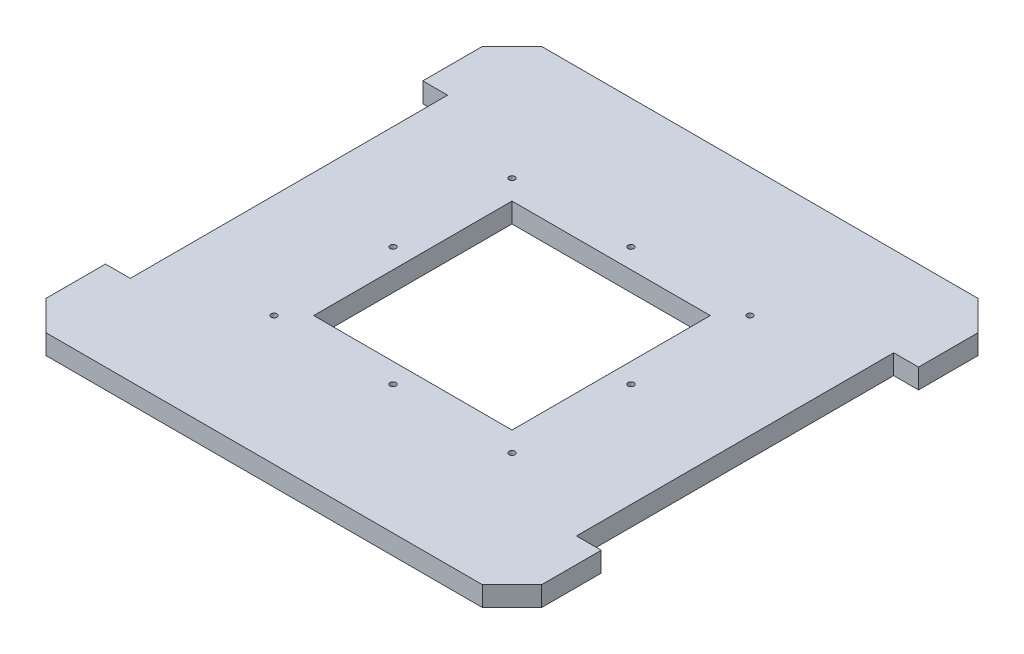
ISO-10303-21;
HEADER;
FILE_DESCRIPTION(('STEP AP214'),'2;1');
FILE_NAME('part.step','',(''),(''),'','','');
FILE_SCHEMA(('AUTOMOTIVE_DESIGN { 1 0 10303 214 1 1 1 1 }'));
ENDSEC;
DATA;
#1=APPLICATION_CONTEXT('core data for automotive mechanical design processes');
#2=APPLICATION_PROTOCOL_DEFINITION('international standard','automotive_design',2000,#1);
#3=PRODUCT_CONTEXT('',#1,'mechanical');
#4=PRODUCT('Part','Part','',(#3));
#5=PRODUCT_RELATED_PRODUCT_CATEGORY('part','',(#4));
#6=PRODUCT_DEFINITION_FORMATION('','',#4);
#7=PRODUCT_DEFINITION_CONTEXT('part definition',#1,'design');
#8=PRODUCT_DEFINITION('design','',#6,#7);
#9=PRODUCT_DEFINITION_SHAPE('','',#8);
#10=(LENGTH_UNIT() NAMED_UNIT(*) SI_UNIT(.MILLI.,.METRE.));
#11=(NAMED_UNIT(*) PLANE_ANGLE_UNIT() SI_UNIT($,.RADIAN.));
#12=(NAMED_UNIT(*) SI_UNIT($,.STERADIAN.) SOLID_ANGLE_UNIT());
#13=UNCERTAINTY_MEASURE_WITH_UNIT(LENGTH_MEASURE(1.E-05),#10,'distance_accuracy_value','');
#14=(GEOMETRIC_REPRESENTATION_CONTEXT(3) GLOBAL_UNCERTAINTY_ASSIGNED_CONTEXT((#13)) GLOBAL_UNIT_ASSIGNED_CONTEXT((#10,
#11,#12)) REPRESENTATION_CONTEXT('',''));
#15=CARTESIAN_POINT('',(0.,0.,0.));
#16=DIRECTION('',(0.,0.,1.));
#17=DIRECTION('',(1.,0.,0.));
#18=AXIS2_PLACEMENT_3D('',#15,#16,#17);
#19=CARTESIAN_POINT('',(62.5,5.,-55.0000000000001));
#20=DIRECTION('',(-1.,0.,0.));
#21=DIRECTION('',(0.,0.,1.));
#22=AXIS2_PLACEMENT_3D('',#19,#20,#21);
#23=PLANE('',#22);
#24=DIRECTION('',(0.,0.,-1.));
#25=VECTOR('',#24,1.);
#26=CARTESIAN_POINT('',(62.5,0.,-55.0000000000001));
#27=LINE('',#26,#25);
#28=CARTESIAN_POINT('',(62.5,0.,55.0000000000001));
#29=VERTEX_POINT('',#28);
#30=CARTESIAN_POINT('',(62.5,0.,40.));
#31=VERTEX_POINT('',#30);
#32=EDGE_CURVE('E338',#29,#31,#27,.T.);
#33=ORIENTED_EDGE('',*,*,#32,.T.);
#34=DIRECTION('',(0.,1.,0.));
#35=VECTOR('',#34,1.);
#36=CARTESIAN_POINT('',(62.5,0.,40.));
#37=LINE('',#36,#35);
#38=CARTESIAN_POINT('',(62.5,5.,40.));
#39=VERTEX_POINT('',#38);
#40=EDGE_CURVE('E203',#31,#39,#37,.T.);
#41=ORIENTED_EDGE('',*,*,#40,.T.);
#42=DIRECTION('',(0.,0.,-1.));
#43=VECTOR('',#42,1.);
#44=CARTESIAN_POINT('',(62.5,5.,-55.0000000000001));
#45=LINE('',#44,#43);
#46=CARTESIAN_POINT('',(62.5,5.,55.0000000000001));
#47=VERTEX_POINT('',#46);
#48=EDGE_CURVE('E322',#47,#39,#45,.T.);
#49=ORIENTED_EDGE('',*,*,#48,.F.);
#50=DIRECTION('',(0.,-1.,0.));
#51=VECTOR('',#50,1.);
#52=CARTESIAN_POINT('',(62.5,5.,55.0000000000001));
#53=LINE('',#52,#51);
#54=EDGE_CURVE('E362',#47,#29,#53,.T.);
#55=ORIENTED_EDGE('',*,*,#54,.T.);
#56=EDGE_LOOP('',(#33,#41,#49,#55));
#57=FACE_BOUND('',#56,.T.);
#58=ADVANCED_FACE('F35',(#57),#23,.F.);
#59=CARTESIAN_POINT('',(-62.5000000000001,5.,0.));
#60=DIRECTION('',(1.,0.,0.));
#61=DIRECTION('',(0.,0.,-1.));
#62=AXIS2_PLACEMENT_3D('',#59,#60,#61);
#63=PLANE('',#62);
#64=DIRECTION('',(0.,0.,1.));
#65=VECTOR('',#64,1.);
#66=CARTESIAN_POINT('',(-62.5000000000001,0.,0.));
#67=LINE('',#66,#65);
#68=CARTESIAN_POINT('',(-62.5,0.,-55.0000000000001));
#69=VERTEX_POINT('',#68);
#70=CARTESIAN_POINT('',(-62.5,0.,-40.));
#71=VERTEX_POINT('',#70);
#72=EDGE_CURVE('E348',#69,#71,#67,.T.);
#73=ORIENTED_EDGE('',*,*,#72,.T.);
#74=DIRECTION('',(0.,1.,0.));
#75=VECTOR('',#74,1.);
#76=CARTESIAN_POINT('',(-62.5,0.,-40.));
#77=LINE('',#76,#75);
#78=CARTESIAN_POINT('',(-62.5,5.,-40.));
#79=VERTEX_POINT('',#78);
#80=EDGE_CURVE('E201',#71,#79,#77,.T.);
#81=ORIENTED_EDGE('',*,*,#80,.T.);
#82=DIRECTION('',(0.,0.,1.));
#83=VECTOR('',#82,1.);
#84=CARTESIAN_POINT('',(-62.5,5.,55.0000000000001));
#85=LINE('',#84,#83);
#86=CARTESIAN_POINT('',(-62.5,5.,-55.0000000000001));
#87=VERTEX_POINT('',#86);
#88=EDGE_CURVE('E311',#87,#79,#85,.T.);
#89=ORIENTED_EDGE('',*,*,#88,.F.);
#90=DIRECTION('',(0.,-1.,0.));
#91=VECTOR('',#90,1.);
#92=CARTESIAN_POINT('',(-62.5,5.,-55.0000000000001));
#93=LINE('',#92,#91);
#94=EDGE_CURVE('E332',#87,#69,#93,.T.);
#95=ORIENTED_EDGE('',*,*,#94,.T.);
#96=EDGE_LOOP('',(#73,#81,#89,#95));
#97=FACE_BOUND('',#96,.T.);
#98=ADVANCED_FACE('F405',(#97),#63,.F.);
#99=CARTESIAN_POINT('',(0.,5.,0.));
#100=DIRECTION('',(0.,-1.,0.));
#101=DIRECTION('',(0.,0.,-1.));
#102=AXIS2_PLACEMENT_3D('',#99,#100,#101);
#103=PLANE('',#102);
#104=ORIENTED_EDGE('',*,*,#48,.T.);
#105=DIRECTION('',(1.,0.,0.));
#106=VECTOR('',#105,1.);
#107=CARTESIAN_POINT('',(62.5,5.,40.));
#108=LINE('',#107,#106);
#109=CARTESIAN_POINT('',(56.25,5.,40.));
#110=VERTEX_POINT('',#109);
#111=EDGE_CURVE('E194',#110,#39,#108,.T.);
#112=ORIENTED_EDGE('',*,*,#111,.F.);
#113=DIRECTION('',(0.,0.,1.));
#114=VECTOR('',#113,1.);
#115=CARTESIAN_POINT('',(56.25,5.,40.));
#116=LINE('',#115,#114);
#117=CARTESIAN_POINT('',(56.25,5.,-40.));
#118=VERTEX_POINT('',#117);
#119=EDGE_CURVE('E196',#118,#110,#116,.T.);
#120=ORIENTED_EDGE('',*,*,#119,.F.);
#121=DIRECTION('',(-1.,0.,0.));
#122=VECTOR('',#121,1.);
#123=CARTESIAN_POINT('',(62.5,5.,-40.));
#124=LINE('',#123,#122);
#125=CARTESIAN_POINT('',(62.5,5.,-40.));
#126=VERTEX_POINT('',#125);
#127=EDGE_CURVE('E174',#126,#118,#124,.T.);
#128=ORIENTED_EDGE('',*,*,#127,.F.);
#129=CARTESIAN_POINT('',(62.5,5.,-55.0000000000001));
#130=VERTEX_POINT('',#129);
#131=EDGE_CURVE('E321',#126,#130,#45,.T.);
#132=ORIENTED_EDGE('',*,*,#131,.T.);
#133=DIRECTION('',(-0.707106781186548,0.,-0.707106781186547));
#134=VECTOR('',#133,1.);
#135=CARTESIAN_POINT('',(55.,5.,-62.5000000000001));
#136=LINE('',#135,#134);
#137=CARTESIAN_POINT('',(55.,5.,-62.5000000000001));
#138=VERTEX_POINT('',#137);
#139=EDGE_CURVE('E325',#130,#138,#136,.T.);
#140=ORIENTED_EDGE('',*,*,#139,.T.);
#141=DIRECTION('',(-1.,0.,0.));
#142=VECTOR('',#141,1.);
#143=CARTESIAN_POINT('',(-55.,5.,-62.5000000000001));
#144=LINE('',#143,#142);
#145=CARTESIAN_POINT('',(-55.,5.,-62.5000000000001));
#146=VERTEX_POINT('',#145);
#147=EDGE_CURVE('E327',#138,#146,#144,.T.);
#148=ORIENTED_EDGE('',*,*,#147,.T.);
#149=DIRECTION('',(-0.707106781186549,0.,0.707106781186546));
#150=VECTOR('',#149,1.);
#151=CARTESIAN_POINT('',(-62.5,5.,-55.0000000000001));
#152=LINE('',#151,#150);
#153=EDGE_CURVE('E329',#146,#87,#152,.T.);
#154=ORIENTED_EDGE('',*,*,#153,.T.);
#155=ORIENTED_EDGE('',*,*,#88,.T.);
#156=DIRECTION('',(-1.,0.,0.));
#157=VECTOR('',#156,1.);
#158=CARTESIAN_POINT('',(-62.5,5.,-40.));
#159=LINE('',#158,#157);
#160=CARTESIAN_POINT('',(-56.25,5.,-40.));
#161=VERTEX_POINT('',#160);
#162=EDGE_CURVE('E211',#161,#79,#159,.T.);
#163=ORIENTED_EDGE('',*,*,#162,.F.);
#164=DIRECTION('',(0.,0.,-1.));
#165=VECTOR('',#164,1.);
#166=CARTESIAN_POINT('',(-56.25,5.,40.));
#167=LINE('',#166,#165);
#168=CARTESIAN_POINT('',(-56.25,5.,40.));
#169=VERTEX_POINT('',#168);
#170=EDGE_CURVE('E221',#169,#161,#167,.T.);
#171=ORIENTED_EDGE('',*,*,#170,.F.);
#172=DIRECTION('',(1.,0.,0.));
#173=VECTOR('',#172,1.);
#174=CARTESIAN_POINT('',(-62.5,5.,40.));
#175=LINE('',#174,#173);
#176=CARTESIAN_POINT('',(-62.5,5.,40.));
#177=VERTEX_POINT('',#176);
#178=EDGE_CURVE('E218',#177,#169,#175,.T.);
#179=ORIENTED_EDGE('',*,*,#178,.F.);
#180=CARTESIAN_POINT('',(-62.5,5.,55.0000000000001));
#181=VERTEX_POINT('',#180);
#182=EDGE_CURVE('E315',#177,#181,#85,.T.);
#183=ORIENTED_EDGE('',*,*,#182,.T.);
#184=DIRECTION('',(0.70710678118655,0.,0.707106781186545));
#185=VECTOR('',#184,1.);
#186=CARTESIAN_POINT('',(-55.,5.,62.5000000000001));
#187=LINE('',#186,#185);
#188=CARTESIAN_POINT('',(-55.,5.,62.5000000000001));
#189=VERTEX_POINT('',#188);
#190=EDGE_CURVE('E314',#181,#189,#187,.T.);
#191=ORIENTED_EDGE('',*,*,#190,.T.);
#192=DIRECTION('',(1.,0.,0.));
#193=VECTOR('',#192,1.);
#194=CARTESIAN_POINT('',(55.,5.,62.5000000000001));
#195=LINE('',#194,#193);
#196=CARTESIAN_POINT('',(55.,5.,62.5000000000001));
#197=VERTEX_POINT('',#196);
#198=EDGE_CURVE('E317',#189,#197,#195,.T.);
#199=ORIENTED_EDGE('',*,*,#198,.T.);
#200=DIRECTION('',(0.707106781186547,0.,-0.707106781186548));
#201=VECTOR('',#200,1.);
#202=CARTESIAN_POINT('',(62.5,5.,55.0000000000001));
#203=LINE('',#202,#201);
#204=EDGE_CURVE('E319',#197,#47,#203,.T.);
#205=ORIENTED_EDGE('',*,*,#204,.T.);
#206=EDGE_LOOP('',(#104,#112,#120,#128,#132,#140,#148,#154,#155,#163,#171,#179,#183,#191,#199,#205));
#207=FACE_BOUND('',#206,.T.);
#208=DIRECTION('',(0.,0.,-1.));
#209=VECTOR('',#208,1.);
#210=CARTESIAN_POINT('',(25.,5.,-25.));
#211=LINE('',#210,#209);
#212=CARTESIAN_POINT('',(25.,5.,25.));
#213=VERTEX_POINT('',#212);
#214=CARTESIAN_POINT('',(25.,5.,-25.));
#215=VERTEX_POINT('',#214);
#216=EDGE_CURVE('E280',#213,#215,#211,.T.);
#217=ORIENTED_EDGE('',*,*,#216,.F.);
#218=DIRECTION('',(1.,0.,0.));
#219=VECTOR('',#218,1.);
#220=CARTESIAN_POINT('',(-25.,5.,25.));
#221=LINE('',#220,#219);
#222=CARTESIAN_POINT('',(-25.,5.,25.));
#223=VERTEX_POINT('',#222);
#224=EDGE_CURVE('E288',#223,#213,#221,.T.);
#225=ORIENTED_EDGE('',*,*,#224,.F.);
#226=DIRECTION('',(0.,0.,1.));
#227=VECTOR('',#226,1.);
#228=CARTESIAN_POINT('',(-25.,5.,-25.));
#229=LINE('',#228,#227);
#230=CARTESIAN_POINT('',(-25.,5.,-25.));
#231=VERTEX_POINT('',#230);
#232=EDGE_CURVE('E285',#231,#223,#229,.T.);
#233=ORIENTED_EDGE('',*,*,#232,.F.);
#234=DIRECTION('',(-1.,0.,0.));
#235=VECTOR('',#234,1.);
#236=CARTESIAN_POINT('',(-25.,5.,-25.));
#237=LINE('',#236,#235);
#238=EDGE_CURVE('E282',#215,#231,#237,.T.);
#239=ORIENTED_EDGE('',*,*,#238,.F.);
#240=EDGE_LOOP('',(#217,#225,#233,#239));
#241=FACE_BOUND('',#240,.T.);
#242=CARTESIAN_POINT('',(30.,5.,-30.));
#243=DIRECTION('',(0.,1.,0.));
#244=DIRECTION('',(0.,0.,1.));
#245=AXIS2_PLACEMENT_3D('',#242,#243,#244);
#246=CIRCLE('',#245,0.750000000000002);
#247=CARTESIAN_POINT('',(30.,5.,-29.25));
#248=VERTEX_POINT('',#247);
#249=EDGE_CURVE('E274',#248,#248,#246,.T.);
#250=ORIENTED_EDGE('',*,*,#249,.F.);
#251=EDGE_LOOP('',(#250));
#252=FACE_BOUND('',#251,.T.);
#253=CARTESIAN_POINT('',(30.,5.,0.));
#254=DIRECTION('',(0.,1.,0.));
#255=DIRECTION('',(0.,0.,1.));
#256=AXIS2_PLACEMENT_3D('',#253,#254,#255);
#257=CIRCLE('',#256,0.750000000000002);
#258=CARTESIAN_POINT('',(30.,5.,0.749999999999992));
#259=VERTEX_POINT('',#258);
#260=EDGE_CURVE('E268',#259,#259,#257,.T.);
#261=ORIENTED_EDGE('',*,*,#260,.F.);
#262=EDGE_LOOP('',(#261));
#263=FACE_BOUND('',#262,.T.);
#264=CARTESIAN_POINT('',(30.,5.,30.));
#265=DIRECTION('',(0.,1.,0.));
#266=DIRECTION('',(0.,0.,1.));
#267=AXIS2_PLACEMENT_3D('',#264,#265,#266);
#268=CIRCLE('',#267,0.750000000000002);
#269=CARTESIAN_POINT('',(30.,5.,30.75));
#270=VERTEX_POINT('',#269);
#271=EDGE_CURVE('E262',#270,#270,#268,.T.);
#272=ORIENTED_EDGE('',*,*,#271,.F.);
#273=EDGE_LOOP('',(#272));
#274=FACE_BOUND('',#273,.T.);
#275=CARTESIAN_POINT('',(-30.,5.,30.));
#276=DIRECTION('',(0.,1.,0.));
#277=DIRECTION('',(0.,0.,1.));
#278=AXIS2_PLACEMENT_3D('',#275,#276,#277);
#279=CIRCLE('',#278,0.750000000000002);
#280=CARTESIAN_POINT('',(-30.,5.,30.75));
#281=VERTEX_POINT('',#280);
#282=EDGE_CURVE('E256',#281,#281,#279,.T.);
#283=ORIENTED_EDGE('',*,*,#282,.F.);
#284=EDGE_LOOP('',(#283));
#285=FACE_BOUND('',#284,.T.);
#286=CARTESIAN_POINT('',(0.,5.,30.));
#287=DIRECTION('',(0.,1.,0.));
#288=DIRECTION('',(0.,0.,1.));
#289=AXIS2_PLACEMENT_3D('',#286,#287,#288);
#290=CIRCLE('',#289,0.75);
#291=CARTESIAN_POINT('',(0.,5.,30.75));
#292=VERTEX_POINT('',#291);
#293=EDGE_CURVE('E250',#292,#292,#290,.T.);
#294=ORIENTED_EDGE('',*,*,#293,.F.);
#295=EDGE_LOOP('',(#294));
#296=FACE_BOUND('',#295,.T.);
#297=CARTESIAN_POINT('',(-30.,5.,0.));
#298=DIRECTION('',(0.,1.,0.));
#299=DIRECTION('',(0.,0.,1.));
#300=AXIS2_PLACEMENT_3D('',#297,#298,#299);
#301=CIRCLE('',#300,0.750000000000002);
#302=CARTESIAN_POINT('',(-30.,5.,0.749999999999992));
#303=VERTEX_POINT('',#302);
#304=EDGE_CURVE('E244',#303,#303,#301,.T.);
#305=ORIENTED_EDGE('',*,*,#304,.F.);
#306=EDGE_LOOP('',(#305));
#307=FACE_BOUND('',#306,.T.);
#308=CARTESIAN_POINT('',(-30.,5.,-30.));
#309=DIRECTION('',(0.,1.,0.));
#310=DIRECTION('',(0.,0.,1.));
#311=AXIS2_PLACEMENT_3D('',#308,#309,#310);
#312=CIRCLE('',#311,0.750000000000002);
#313=CARTESIAN_POINT('',(-30.,5.,-29.25));
#314=VERTEX_POINT('',#313);
#315=EDGE_CURVE('E238',#314,#314,#312,.T.);
#316=ORIENTED_EDGE('',*,*,#315,.F.);
#317=EDGE_LOOP('',(#316));
#318=FACE_BOUND('',#317,.T.);
#319=CARTESIAN_POINT('',(0.,5.,-30.));
#320=DIRECTION('',(0.,1.,0.));
#321=DIRECTION('',(0.,0.,1.));
#322=AXIS2_PLACEMENT_3D('',#319,#320,#321);
#323=CIRCLE('',#322,0.75);
#324=CARTESIAN_POINT('',(0.,5.,-29.25));
#325=VERTEX_POINT('',#324);
#326=EDGE_CURVE('E232',#325,#325,#323,.T.);
#327=ORIENTED_EDGE('',*,*,#326,.F.);
#328=EDGE_LOOP('',(#327));
#329=FACE_BOUND('',#328,.T.);
#330=ADVANCED_FACE('F388',(#207,#241,#252,#263,#274,#285,#296,#307,#318,#329),#103,.F.);
#331=CARTESIAN_POINT('',(0.,0.,0.));
#332=DIRECTION('',(0.,-1.,0.));
#333=DIRECTION('',(0.,0.,-1.));
#334=AXIS2_PLACEMENT_3D('',#331,#332,#333);
#335=PLANE('',#334);
#336=DIRECTION('',(1.,0.,0.));
#337=VECTOR('',#336,1.);
#338=CARTESIAN_POINT('',(62.5,0.,40.));
#339=LINE('',#338,#337);
#340=CARTESIAN_POINT('',(56.25,0.,40.));
#341=VERTEX_POINT('',#340);
#342=EDGE_CURVE('E187',#341,#31,#339,.T.);
#343=ORIENTED_EDGE('',*,*,#342,.T.);
#344=ORIENTED_EDGE('',*,*,#32,.F.);
#345=DIRECTION('',(0.707106781186547,0.,-0.707106781186548));
#346=VECTOR('',#345,1.);
#347=CARTESIAN_POINT('',(62.5,0.,55.0000000000001));
#348=LINE('',#347,#346);
#349=CARTESIAN_POINT('',(55.,0.,62.5000000000001));
#350=VERTEX_POINT('',#349);
#351=EDGE_CURVE('E336',#350,#29,#348,.T.);
#352=ORIENTED_EDGE('',*,*,#351,.F.);
#353=DIRECTION('',(1.,0.,0.));
#354=VECTOR('',#353,1.);
#355=CARTESIAN_POINT('',(55.,0.,62.5000000000001));
#356=LINE('',#355,#354);
#357=CARTESIAN_POINT('',(-55.,0.,62.5000000000001));
#358=VERTEX_POINT('',#357);
#359=EDGE_CURVE('E334',#358,#350,#356,.T.);
#360=ORIENTED_EDGE('',*,*,#359,.F.);
#361=DIRECTION('',(0.70710678118655,0.,0.707106781186545));
#362=VECTOR('',#361,1.);
#363=CARTESIAN_POINT('',(-55.,0.,62.5000000000001));
#364=LINE('',#363,#362);
#365=CARTESIAN_POINT('',(-62.5,0.,55.0000000000001));
#366=VERTEX_POINT('',#365);
#367=EDGE_CURVE('E310',#366,#358,#364,.T.);
#368=ORIENTED_EDGE('',*,*,#367,.F.);
#369=CARTESIAN_POINT('',(-62.5000000000002,0.,40.));
#370=VERTEX_POINT('',#369);
#371=EDGE_CURVE('E347',#370,#366,#67,.T.);
#372=ORIENTED_EDGE('',*,*,#371,.F.);
#373=DIRECTION('',(1.,0.,0.));
#374=VECTOR('',#373,1.);
#375=CARTESIAN_POINT('',(-62.5,0.,40.));
#376=LINE('',#375,#374);
#377=CARTESIAN_POINT('',(-56.25,0.,40.));
#378=VERTEX_POINT('',#377);
#379=EDGE_CURVE('E58',#370,#378,#376,.T.);
#380=ORIENTED_EDGE('',*,*,#379,.T.);
#381=DIRECTION('',(0.,0.,-1.));
#382=VECTOR('',#381,1.);
#383=CARTESIAN_POINT('',(-56.25,0.,40.));
#384=LINE('',#383,#382);
#385=CARTESIAN_POINT('',(-56.25,0.,-40.));
#386=VERTEX_POINT('',#385);
#387=EDGE_CURVE('E210',#378,#386,#384,.T.);
#388=ORIENTED_EDGE('',*,*,#387,.T.);
#389=DIRECTION('',(-1.,0.,0.));
#390=VECTOR('',#389,1.);
#391=CARTESIAN_POINT('',(-62.5,0.,-40.));
#392=LINE('',#391,#390);
#393=EDGE_CURVE('E214',#386,#71,#392,.T.);
#394=ORIENTED_EDGE('',*,*,#393,.T.);
#395=ORIENTED_EDGE('',*,*,#72,.F.);
#396=DIRECTION('',(-0.707106781186549,0.,0.707106781186546));
#397=VECTOR('',#396,1.);
#398=CARTESIAN_POINT('',(-62.5,0.,-55.0000000000001));
#399=LINE('',#398,#397);
#400=CARTESIAN_POINT('',(-55.,0.,-62.5000000000001));
#401=VERTEX_POINT('',#400);
#402=EDGE_CURVE('E345',#401,#69,#399,.T.);
#403=ORIENTED_EDGE('',*,*,#402,.F.);
#404=DIRECTION('',(-1.,0.,0.));
#405=VECTOR('',#404,1.);
#406=CARTESIAN_POINT('',(-55.,0.,-62.5000000000001));
#407=LINE('',#406,#405);
#408=CARTESIAN_POINT('',(55.,0.,-62.5000000000001));
#409=VERTEX_POINT('',#408);
#410=EDGE_CURVE('E343',#409,#401,#407,.T.);
#411=ORIENTED_EDGE('',*,*,#410,.F.);
#412=DIRECTION('',(-0.707106781186548,0.,-0.707106781186547));
#413=VECTOR('',#412,1.);
#414=CARTESIAN_POINT('',(55.,0.,-62.5000000000001));
#415=LINE('',#414,#413);
#416=CARTESIAN_POINT('',(62.5,0.,-55.0000000000001));
#417=VERTEX_POINT('',#416);
#418=EDGE_CURVE('E341',#417,#409,#415,.T.);
#419=ORIENTED_EDGE('',*,*,#418,.F.);
#420=CARTESIAN_POINT('',(62.5,0.,-40.));
#421=VERTEX_POINT('',#420);
#422=EDGE_CURVE('E193',#421,#417,#27,.T.);
#423=ORIENTED_EDGE('',*,*,#422,.F.);
#424=DIRECTION('',(-1.,0.,0.));
#425=VECTOR('',#424,1.);
#426=CARTESIAN_POINT('',(62.5,0.,-40.));
#427=LINE('',#426,#425);
#428=CARTESIAN_POINT('',(56.25,0.,-40.));
#429=VERTEX_POINT('',#428);
#430=EDGE_CURVE('E50',#421,#429,#427,.T.);
#431=ORIENTED_EDGE('',*,*,#430,.T.);
#432=DIRECTION('',(0.,0.,1.));
#433=VECTOR('',#432,1.);
#434=CARTESIAN_POINT('',(56.25,0.,40.));
#435=LINE('',#434,#433);
#436=EDGE_CURVE('E182',#429,#341,#435,.T.);
#437=ORIENTED_EDGE('',*,*,#436,.T.);
#438=EDGE_LOOP('',(#343,#344,#352,#360,#368,#372,#380,#388,#394,#395,#403,#411,#419,#423,#431,#437));
#439=FACE_BOUND('',#438,.T.);
#440=CARTESIAN_POINT('',(-30.,0.,-30.));
#441=DIRECTION('',(0.,1.,0.));
#442=DIRECTION('',(0.,0.,1.));
#443=AXIS2_PLACEMENT_3D('',#440,#441,#442);
#444=CIRCLE('',#443,0.750000000000002);
#445=CARTESIAN_POINT('',(-30.,0.,-29.25));
#446=VERTEX_POINT('',#445);
#447=EDGE_CURVE('E235',#446,#446,#444,.T.);
#448=ORIENTED_EDGE('',*,*,#447,.T.);
#449=EDGE_LOOP('',(#448));
#450=FACE_BOUND('',#449,.T.);
#451=CARTESIAN_POINT('',(0.,0.,30.));
#452=DIRECTION('',(0.,1.,0.));
#453=DIRECTION('',(0.,0.,1.));
#454=AXIS2_PLACEMENT_3D('',#451,#452,#453);
#455=CIRCLE('',#454,0.75);
#456=CARTESIAN_POINT('',(0.,0.,30.75));
#457=VERTEX_POINT('',#456);
#458=EDGE_CURVE('E247',#457,#457,#455,.T.);
#459=ORIENTED_EDGE('',*,*,#458,.T.);
#460=EDGE_LOOP('',(#459));
#461=FACE_BOUND('',#460,.T.);
#462=CARTESIAN_POINT('',(30.,0.,30.));
#463=DIRECTION('',(0.,1.,0.));
#464=DIRECTION('',(0.,0.,1.));
#465=AXIS2_PLACEMENT_3D('',#462,#463,#464);
#466=CIRCLE('',#465,0.750000000000002);
#467=CARTESIAN_POINT('',(30.,0.,30.75));
#468=VERTEX_POINT('',#467);
#469=EDGE_CURVE('E259',#468,#468,#466,.T.);
#470=ORIENTED_EDGE('',*,*,#469,.T.);
#471=EDGE_LOOP('',(#470));
#472=FACE_BOUND('',#471,.T.);
#473=CARTESIAN_POINT('',(30.,0.,-30.));
#474=DIRECTION('',(0.,1.,0.));
#475=DIRECTION('',(0.,0.,1.));
#476=AXIS2_PLACEMENT_3D('',#473,#474,#475);
#477=CIRCLE('',#476,0.750000000000002);
#478=CARTESIAN_POINT('',(30.,0.,-29.25));
#479=VERTEX_POINT('',#478);
#480=EDGE_CURVE('E271',#479,#479,#477,.T.);
#481=ORIENTED_EDGE('',*,*,#480,.T.);
#482=EDGE_LOOP('',(#481));
#483=FACE_BOUND('',#482,.T.);
#484=DIRECTION('',(1.,0.,0.));
#485=VECTOR('',#484,1.);
#486=CARTESIAN_POINT('',(-25.,0.,25.));
#487=LINE('',#486,#485);
#488=CARTESIAN_POINT('',(-25.,0.,25.));
#489=VERTEX_POINT('',#488);
#490=CARTESIAN_POINT('',(25.,0.,25.));
#491=VERTEX_POINT('',#490);
#492=EDGE_CURVE('E283',#489,#491,#487,.T.);
#493=ORIENTED_EDGE('',*,*,#492,.T.);
#494=DIRECTION('',(0.,0.,-1.));
#495=VECTOR('',#494,1.);
#496=CARTESIAN_POINT('',(25.,0.,-25.));
#497=LINE('',#496,#495);
#498=CARTESIAN_POINT('',(25.,0.,-25.));
#499=VERTEX_POINT('',#498);
#500=EDGE_CURVE('E277',#491,#499,#497,.T.);
#501=ORIENTED_EDGE('',*,*,#500,.T.);
#502=DIRECTION('',(-1.,0.,0.));
#503=VECTOR('',#502,1.);
#504=CARTESIAN_POINT('',(-25.,0.,-25.));
#505=LINE('',#504,#503);
#506=CARTESIAN_POINT('',(-25.,0.,-25.));
#507=VERTEX_POINT('',#506);
#508=EDGE_CURVE('E293',#499,#507,#505,.T.);
#509=ORIENTED_EDGE('',*,*,#508,.T.);
#510=DIRECTION('',(0.,0.,1.));
#511=VECTOR('',#510,1.);
#512=CARTESIAN_POINT('',(-25.,0.,-25.));
#513=LINE('',#512,#511);
#514=EDGE_CURVE('E296',#507,#489,#513,.T.);
#515=ORIENTED_EDGE('',*,*,#514,.T.);
#516=EDGE_LOOP('',(#493,#501,#509,#515));
#517=FACE_BOUND('',#516,.T.);
#518=CARTESIAN_POINT('',(30.,0.,0.));
#519=DIRECTION('',(0.,1.,0.));
#520=DIRECTION('',(0.,0.,1.));
#521=AXIS2_PLACEMENT_3D('',#518,#519,#520);
#522=CIRCLE('',#521,0.750000000000002);
#523=CARTESIAN_POINT('',(30.,0.,0.749999999999992));
#524=VERTEX_POINT('',#523);
#525=EDGE_CURVE('E265',#524,#524,#522,.T.);
#526=ORIENTED_EDGE('',*,*,#525,.T.);
#527=EDGE_LOOP('',(#526));
#528=FACE_BOUND('',#527,.T.);
#529=CARTESIAN_POINT('',(-30.,0.,30.));
#530=DIRECTION('',(0.,1.,0.));
#531=DIRECTION('',(0.,0.,1.));
#532=AXIS2_PLACEMENT_3D('',#529,#530,#531);
#533=CIRCLE('',#532,0.750000000000002);
#534=CARTESIAN_POINT('',(-30.,0.,30.75));
#535=VERTEX_POINT('',#534);
#536=EDGE_CURVE('E253',#535,#535,#533,.T.);
#537=ORIENTED_EDGE('',*,*,#536,.T.);
#538=EDGE_LOOP('',(#537));
#539=FACE_BOUND('',#538,.T.);
#540=CARTESIAN_POINT('',(-30.,0.,0.));
#541=DIRECTION('',(0.,1.,0.));
#542=DIRECTION('',(0.,0.,1.));
#543=AXIS2_PLACEMENT_3D('',#540,#541,#542);
#544=CIRCLE('',#543,0.750000000000002);
#545=CARTESIAN_POINT('',(-30.,0.,0.749999999999992));
#546=VERTEX_POINT('',#545);
#547=EDGE_CURVE('E241',#546,#546,#544,.T.);
#548=ORIENTED_EDGE('',*,*,#547,.T.);
#549=EDGE_LOOP('',(#548));
#550=FACE_BOUND('',#549,.T.);
#551=CARTESIAN_POINT('',(0.,0.,-30.));
#552=DIRECTION('',(0.,1.,0.));
#553=DIRECTION('',(0.,0.,1.));
#554=AXIS2_PLACEMENT_3D('',#551,#552,#553);
#555=CIRCLE('',#554,0.75);
#556=CARTESIAN_POINT('',(0.,0.,-29.25));
#557=VERTEX_POINT('',#556);
#558=EDGE_CURVE('E206',#557,#557,#555,.T.);
#559=ORIENTED_EDGE('',*,*,#558,.T.);
#560=EDGE_LOOP('',(#559));
#561=FACE_BOUND('',#560,.T.);
#562=ADVANCED_FACE('F190',(#439,#450,#461,#472,#483,#517,#528,#539,#550,#561),#335,.T.);
#563=CARTESIAN_POINT('',(-55.,5.,62.5000000000001));
#564=DIRECTION('',(0.707106781186545,0.,-0.70710678118655));
#565=DIRECTION('',(-0.70710678118655,0.,-0.707106781186545));
#566=AXIS2_PLACEMENT_3D('',#563,#564,#565);
#567=PLANE('',#566);
#568=ORIENTED_EDGE('',*,*,#367,.T.);
#569=DIRECTION('',(0.,-1.,0.));
#570=VECTOR('',#569,1.);
#571=CARTESIAN_POINT('',(-55.,5.,62.5000000000001));
#572=LINE('',#571,#570);
#573=EDGE_CURVE('E43',#189,#358,#572,.T.);
#574=ORIENTED_EDGE('',*,*,#573,.F.);
#575=ORIENTED_EDGE('',*,*,#190,.F.);
#576=DIRECTION('',(0.,-1.,0.));
#577=VECTOR('',#576,1.);
#578=CARTESIAN_POINT('',(-62.5,5.,55.0000000000001));
#579=LINE('',#578,#577);
#580=EDGE_CURVE('E11',#181,#366,#579,.T.);
#581=ORIENTED_EDGE('',*,*,#580,.T.);
#582=EDGE_LOOP('',(#568,#574,#575,#581));
#583=FACE_BOUND('',#582,.T.);
#584=ADVANCED_FACE('F37',(#583),#567,.F.);
#585=CARTESIAN_POINT('',(55.,5.,62.5000000000001));
#586=DIRECTION('',(0.,0.,-1.));
#587=DIRECTION('',(-1.,0.,0.));
#588=AXIS2_PLACEMENT_3D('',#585,#586,#587);
#589=PLANE('',#588);
#590=ORIENTED_EDGE('',*,*,#359,.T.);
#591=DIRECTION('',(0.,-1.,0.));
#592=VECTOR('',#591,1.);
#593=CARTESIAN_POINT('',(55.,5.,62.5000000000001));
#594=LINE('',#593,#592);
#595=EDGE_CURVE('E365',#197,#350,#594,.T.);
#596=ORIENTED_EDGE('',*,*,#595,.F.);
#597=ORIENTED_EDGE('',*,*,#198,.F.);
#598=ORIENTED_EDGE('',*,*,#573,.T.);
#599=EDGE_LOOP('',(#590,#596,#597,#598));
#600=FACE_BOUND('',#599,.T.);
#601=ADVANCED_FACE('F372',(#600),#589,.F.);
#602=CARTESIAN_POINT('',(62.5,5.,55.0000000000001));
#603=DIRECTION('',(-0.707106781186548,0.,-0.707106781186547));
#604=DIRECTION('',(-0.707106781186547,0.,0.707106781186548));
#605=AXIS2_PLACEMENT_3D('',#602,#603,#604);
#606=PLANE('',#605);
#607=ORIENTED_EDGE('',*,*,#351,.T.);
#608=ORIENTED_EDGE('',*,*,#54,.F.);
#609=ORIENTED_EDGE('',*,*,#204,.F.);
#610=ORIENTED_EDGE('',*,*,#595,.T.);
#611=EDGE_LOOP('',(#607,#608,#609,#610));
#612=FACE_BOUND('',#611,.T.);
#613=ADVANCED_FACE('F382',(#612),#606,.F.);
#614=ORIENTED_EDGE('',*,*,#131,.F.);
#615=DIRECTION('',(0.,1.,0.));
#616=VECTOR('',#615,1.);
#617=CARTESIAN_POINT('',(62.5,0.,-40.));
#618=LINE('',#617,#616);
#619=EDGE_CURVE('E179',#421,#126,#618,.T.);
#620=ORIENTED_EDGE('',*,*,#619,.F.);
#621=ORIENTED_EDGE('',*,*,#422,.T.);
#622=DIRECTION('',(0.,-1.,0.));
#623=VECTOR('',#622,1.);
#624=CARTESIAN_POINT('',(62.5,5.,-55.0000000000001));
#625=LINE('',#624,#623);
#626=EDGE_CURVE('E359',#130,#417,#625,.T.);
#627=ORIENTED_EDGE('',*,*,#626,.F.);
#628=EDGE_LOOP('',(#614,#620,#621,#627));
#629=FACE_BOUND('',#628,.T.);
#630=ADVANCED_FACE('F423',(#629),#23,.F.);
#631=CARTESIAN_POINT('',(55.,5.,-62.5000000000001));
#632=DIRECTION('',(-0.707106781186547,0.,0.707106781186548));
#633=DIRECTION('',(0.707106781186548,0.,0.707106781186547));
#634=AXIS2_PLACEMENT_3D('',#631,#632,#633);
#635=PLANE('',#634);
#636=ORIENTED_EDGE('',*,*,#418,.T.);
#637=DIRECTION('',(0.,-1.,0.));
#638=VECTOR('',#637,1.);
#639=CARTESIAN_POINT('',(55.,5.,-62.5000000000001));
#640=LINE('',#639,#638);
#641=EDGE_CURVE('E356',#138,#409,#640,.T.);
#642=ORIENTED_EDGE('',*,*,#641,.F.);
#643=ORIENTED_EDGE('',*,*,#139,.F.);
#644=ORIENTED_EDGE('',*,*,#626,.T.);
#645=EDGE_LOOP('',(#636,#642,#643,#644));
#646=FACE_BOUND('',#645,.T.);
#647=ADVANCED_FACE('F419',(#646),#635,.F.);
#648=CARTESIAN_POINT('',(-55.,5.,-62.5000000000001));
#649=DIRECTION('',(0.,0.,1.));
#650=DIRECTION('',(1.,0.,0.));
#651=AXIS2_PLACEMENT_3D('',#648,#649,#650);
#652=PLANE('',#651);
#653=ORIENTED_EDGE('',*,*,#410,.T.);
#654=DIRECTION('',(0.,-1.,0.));
#655=VECTOR('',#654,1.);
#656=CARTESIAN_POINT('',(-55.,5.,-62.5000000000001));
#657=LINE('',#656,#655);
#658=EDGE_CURVE('E353',#146,#401,#657,.T.);
#659=ORIENTED_EDGE('',*,*,#658,.F.);
#660=ORIENTED_EDGE('',*,*,#147,.F.);
#661=ORIENTED_EDGE('',*,*,#641,.T.);
#662=EDGE_LOOP('',(#653,#659,#660,#661));
#663=FACE_BOUND('',#662,.T.);
#664=ADVANCED_FACE('F415',(#663),#652,.F.);
#665=CARTESIAN_POINT('',(-62.5,5.,-55.0000000000001));
#666=DIRECTION('',(0.707106781186546,0.,0.707106781186549));
#667=DIRECTION('',(0.707106781186549,0.,-0.707106781186546));
#668=AXIS2_PLACEMENT_3D('',#665,#666,#667);
#669=PLANE('',#668);
#670=ORIENTED_EDGE('',*,*,#402,.T.);
#671=ORIENTED_EDGE('',*,*,#94,.F.);
#672=ORIENTED_EDGE('',*,*,#153,.F.);
#673=ORIENTED_EDGE('',*,*,#658,.T.);
#674=EDGE_LOOP('',(#670,#671,#672,#673));
#675=FACE_BOUND('',#674,.T.);
#676=ADVANCED_FACE('F411',(#675),#669,.F.);
#677=ORIENTED_EDGE('',*,*,#182,.F.);
#678=DIRECTION('',(0.,1.,0.));
#679=VECTOR('',#678,1.);
#680=CARTESIAN_POINT('',(-62.5,0.,40.));
#681=LINE('',#680,#679);
#682=EDGE_CURVE('E217',#370,#177,#681,.T.);
#683=ORIENTED_EDGE('',*,*,#682,.F.);
#684=ORIENTED_EDGE('',*,*,#371,.T.);
#685=ORIENTED_EDGE('',*,*,#580,.F.);
#686=EDGE_LOOP('',(#677,#683,#684,#685));
#687=FACE_BOUND('',#686,.T.);
#688=ADVANCED_FACE('F394',(#687),#63,.F.);
#689=CARTESIAN_POINT('',(25.,5.,-25.));
#690=DIRECTION('',(-1.,0.,0.));
#691=DIRECTION('',(0.,0.,1.));
#692=AXIS2_PLACEMENT_3D('',#689,#690,#691);
#693=PLANE('',#692);
#694=ORIENTED_EDGE('',*,*,#500,.F.);
#695=DIRECTION('',(0.,-1.,0.));
#696=VECTOR('',#695,1.);
#697=CARTESIAN_POINT('',(25.,5.,25.));
#698=LINE('',#697,#696);
#699=EDGE_CURVE('E290',#213,#491,#698,.T.);
#700=ORIENTED_EDGE('',*,*,#699,.F.);
#701=ORIENTED_EDGE('',*,*,#216,.T.);
#702=DIRECTION('',(0.,-1.,0.));
#703=VECTOR('',#702,1.);
#704=CARTESIAN_POINT('',(25.,5.,-25.));
#705=LINE('',#704,#703);
#706=EDGE_CURVE('E307',#215,#499,#705,.T.);
#707=ORIENTED_EDGE('',*,*,#706,.T.);
#708=EDGE_LOOP('',(#694,#700,#701,#707));
#709=FACE_BOUND('',#708,.T.);
#710=ADVANCED_FACE('F444',(#709),#693,.T.);
#711=CARTESIAN_POINT('',(-25.,5.,-25.));
#712=DIRECTION('',(0.,0.,1.));
#713=DIRECTION('',(1.,0.,0.));
#714=AXIS2_PLACEMENT_3D('',#711,#712,#713);
#715=PLANE('',#714);
#716=ORIENTED_EDGE('',*,*,#508,.F.);
#717=ORIENTED_EDGE('',*,*,#706,.F.);
#718=ORIENTED_EDGE('',*,*,#238,.T.);
#719=DIRECTION('',(0.,-1.,0.));
#720=VECTOR('',#719,1.);
#721=CARTESIAN_POINT('',(-25.,5.,-25.));
#722=LINE('',#721,#720);
#723=EDGE_CURVE('E305',#231,#507,#722,.T.);
#724=ORIENTED_EDGE('',*,*,#723,.T.);
#725=EDGE_LOOP('',(#716,#717,#718,#724));
#726=FACE_BOUND('',#725,.T.);
#727=ADVANCED_FACE('F449',(#726),#715,.T.);
#728=CARTESIAN_POINT('',(-25.,5.,-25.));
#729=DIRECTION('',(1.,0.,0.));
#730=DIRECTION('',(0.,0.,-1.));
#731=AXIS2_PLACEMENT_3D('',#728,#729,#730);
#732=PLANE('',#731);
#733=ORIENTED_EDGE('',*,*,#514,.F.);
#734=ORIENTED_EDGE('',*,*,#723,.F.);
#735=ORIENTED_EDGE('',*,*,#232,.T.);
#736=DIRECTION('',(0.,-1.,0.));
#737=VECTOR('',#736,1.);
#738=CARTESIAN_POINT('',(-25.,5.,25.));
#739=LINE('',#738,#737);
#740=EDGE_CURVE('E303',#223,#489,#739,.T.);
#741=ORIENTED_EDGE('',*,*,#740,.T.);
#742=EDGE_LOOP('',(#733,#734,#735,#741));
#743=FACE_BOUND('',#742,.T.);
#744=ADVANCED_FACE('F597',(#743),#732,.T.);
#745=CARTESIAN_POINT('',(-25.,5.,25.));
#746=DIRECTION('',(0.,0.,-1.));
#747=DIRECTION('',(-1.,0.,0.));
#748=AXIS2_PLACEMENT_3D('',#745,#746,#747);
#749=PLANE('',#748);
#750=ORIENTED_EDGE('',*,*,#492,.F.);
#751=ORIENTED_EDGE('',*,*,#740,.F.);
#752=ORIENTED_EDGE('',*,*,#224,.T.);
#753=ORIENTED_EDGE('',*,*,#699,.T.);
#754=EDGE_LOOP('',(#750,#751,#752,#753));
#755=FACE_BOUND('',#754,.T.);
#756=ADVANCED_FACE('F587',(#755),#749,.T.);
#757=CARTESIAN_POINT('',(30.,5.,-30.));
#758=DIRECTION('',(0.,-1.,0.));
#759=DIRECTION('',(0.,0.,-1.));
#760=AXIS2_PLACEMENT_3D('',#757,#758,#759);
#761=CYLINDRICAL_SURFACE('',#760,0.750000000000002);
#762=ORIENTED_EDGE('',*,*,#249,.T.);
#763=EDGE_LOOP('',(#762));
#764=FACE_BOUND('',#763,.T.);
#765=ORIENTED_EDGE('',*,*,#480,.F.);
#766=EDGE_LOOP('',(#765));
#767=FACE_BOUND('',#766,.T.);
#768=ADVANCED_FACE('F577',(#764,#767),#761,.F.);
#769=CARTESIAN_POINT('',(30.,5.,0.));
#770=DIRECTION('',(0.,-1.,0.));
#771=DIRECTION('',(0.,0.,-1.));
#772=AXIS2_PLACEMENT_3D('',#769,#770,#771);
#773=CYLINDRICAL_SURFACE('',#772,0.750000000000002);
#774=ORIENTED_EDGE('',*,*,#260,.T.);
#775=EDGE_LOOP('',(#774));
#776=FACE_BOUND('',#775,.T.);
#777=ORIENTED_EDGE('',*,*,#525,.F.);
#778=EDGE_LOOP('',(#777));
#779=FACE_BOUND('',#778,.T.);
#780=ADVANCED_FACE('F567',(#776,#779),#773,.F.);
#781=CARTESIAN_POINT('',(30.,5.,30.));
#782=DIRECTION('',(0.,-1.,0.));
#783=DIRECTION('',(0.,0.,-1.));
#784=AXIS2_PLACEMENT_3D('',#781,#782,#783);
#785=CYLINDRICAL_SURFACE('',#784,0.750000000000002);
#786=ORIENTED_EDGE('',*,*,#271,.T.);
#787=EDGE_LOOP('',(#786));
#788=FACE_BOUND('',#787,.T.);
#789=ORIENTED_EDGE('',*,*,#469,.F.);
#790=EDGE_LOOP('',(#789));
#791=FACE_BOUND('',#790,.T.);
#792=ADVANCED_FACE('F557',(#788,#791),#785,.F.);
#793=CARTESIAN_POINT('',(-30.,5.,30.));
#794=DIRECTION('',(0.,-1.,0.));
#795=DIRECTION('',(0.,0.,-1.));
#796=AXIS2_PLACEMENT_3D('',#793,#794,#795);
#797=CYLINDRICAL_SURFACE('',#796,0.750000000000002);
#798=ORIENTED_EDGE('',*,*,#282,.T.);
#799=EDGE_LOOP('',(#798));
#800=FACE_BOUND('',#799,.T.);
#801=ORIENTED_EDGE('',*,*,#536,.F.);
#802=EDGE_LOOP('',(#801));
#803=FACE_BOUND('',#802,.T.);
#804=ADVANCED_FACE('F547',(#800,#803),#797,.F.);
#805=CARTESIAN_POINT('',(0.,5.,30.));
#806=DIRECTION('',(0.,-1.,0.));
#807=DIRECTION('',(0.,0.,-1.));
#808=AXIS2_PLACEMENT_3D('',#805,#806,#807);
#809=CYLINDRICAL_SURFACE('',#808,0.75);
#810=ORIENTED_EDGE('',*,*,#293,.T.);
#811=EDGE_LOOP('',(#810));
#812=FACE_BOUND('',#811,.T.);
#813=ORIENTED_EDGE('',*,*,#458,.F.);
#814=EDGE_LOOP('',(#813));
#815=FACE_BOUND('',#814,.T.);
#816=ADVANCED_FACE('F537',(#812,#815),#809,.F.);
#817=CARTESIAN_POINT('',(-30.,5.,0.));
#818=DIRECTION('',(0.,-1.,0.));
#819=DIRECTION('',(0.,0.,-1.));
#820=AXIS2_PLACEMENT_3D('',#817,#818,#819);
#821=CYLINDRICAL_SURFACE('',#820,0.750000000000002);
#822=ORIENTED_EDGE('',*,*,#304,.T.);
#823=EDGE_LOOP('',(#822));
#824=FACE_BOUND('',#823,.T.);
#825=ORIENTED_EDGE('',*,*,#547,.F.);
#826=EDGE_LOOP('',(#825));
#827=FACE_BOUND('',#826,.T.);
#828=ADVANCED_FACE('F527',(#824,#827),#821,.F.);
#829=CARTESIAN_POINT('',(-30.,5.,-30.));
#830=DIRECTION('',(0.,-1.,0.));
#831=DIRECTION('',(0.,0.,-1.));
#832=AXIS2_PLACEMENT_3D('',#829,#830,#831);
#833=CYLINDRICAL_SURFACE('',#832,0.750000000000002);
#834=ORIENTED_EDGE('',*,*,#315,.T.);
#835=EDGE_LOOP('',(#834));
#836=FACE_BOUND('',#835,.T.);
#837=ORIENTED_EDGE('',*,*,#447,.F.);
#838=EDGE_LOOP('',(#837));
#839=FACE_BOUND('',#838,.T.);
#840=ADVANCED_FACE('F516',(#836,#839),#833,.F.);
#841=CARTESIAN_POINT('',(0.,5.,-30.));
#842=DIRECTION('',(0.,-1.,0.));
#843=DIRECTION('',(0.,0.,-1.));
#844=AXIS2_PLACEMENT_3D('',#841,#842,#843);
#845=CYLINDRICAL_SURFACE('',#844,0.75);
#846=ORIENTED_EDGE('',*,*,#326,.T.);
#847=EDGE_LOOP('',(#846));
#848=FACE_BOUND('',#847,.T.);
#849=ORIENTED_EDGE('',*,*,#558,.F.);
#850=EDGE_LOOP('',(#849));
#851=FACE_BOUND('',#850,.T.);
#852=ADVANCED_FACE('F511',(#848,#851),#845,.F.);
#853=CARTESIAN_POINT('',(-62.5,0.,-40.));
#854=DIRECTION('',(0.,0.,-1.));
#855=DIRECTION('',(-1.,0.,0.));
#856=AXIS2_PLACEMENT_3D('',#853,#854,#855);
#857=PLANE('',#856);
#858=ORIENTED_EDGE('',*,*,#162,.T.);
#859=ORIENTED_EDGE('',*,*,#80,.F.);
#860=ORIENTED_EDGE('',*,*,#393,.F.);
#861=DIRECTION('',(0.,1.,0.));
#862=VECTOR('',#861,1.);
#863=CARTESIAN_POINT('',(-56.25,0.,-40.));
#864=LINE('',#863,#862);
#865=EDGE_CURVE('E227',#386,#161,#864,.T.);
#866=ORIENTED_EDGE('',*,*,#865,.T.);
#867=EDGE_LOOP('',(#858,#859,#860,#866));
#868=FACE_BOUND('',#867,.T.);
#869=ADVANCED_FACE('F403',(#868),#857,.F.);
#870=CARTESIAN_POINT('',(-56.25,0.,40.));
#871=DIRECTION('',(1.,0.,0.));
#872=DIRECTION('',(0.,0.,-1.));
#873=AXIS2_PLACEMENT_3D('',#870,#871,#872);
#874=PLANE('',#873);
#875=ORIENTED_EDGE('',*,*,#170,.T.);
#876=ORIENTED_EDGE('',*,*,#865,.F.);
#877=ORIENTED_EDGE('',*,*,#387,.F.);
#878=DIRECTION('',(0.,1.,0.));
#879=VECTOR('',#878,1.);
#880=CARTESIAN_POINT('',(-56.25,0.,40.));
#881=LINE('',#880,#879);
#882=EDGE_CURVE('E229',#378,#169,#881,.T.);
#883=ORIENTED_EDGE('',*,*,#882,.T.);
#884=EDGE_LOOP('',(#875,#876,#877,#883));
#885=FACE_BOUND('',#884,.T.);
#886=ADVANCED_FACE('F399',(#885),#874,.F.);
#887=CARTESIAN_POINT('',(-62.5,0.,40.));
#888=DIRECTION('',(0.,0.,1.));
#889=DIRECTION('',(1.,0.,0.));
#890=AXIS2_PLACEMENT_3D('',#887,#888,#889);
#891=PLANE('',#890);
#892=ORIENTED_EDGE('',*,*,#178,.T.);
#893=ORIENTED_EDGE('',*,*,#882,.F.);
#894=ORIENTED_EDGE('',*,*,#379,.F.);
#895=ORIENTED_EDGE('',*,*,#682,.T.);
#896=EDGE_LOOP('',(#892,#893,#894,#895));
#897=FACE_BOUND('',#896,.T.);
#898=ADVANCED_FACE('F651',(#897),#891,.F.);
#899=CARTESIAN_POINT('',(62.5,0.,40.));
#900=DIRECTION('',(0.,0.,1.));
#901=DIRECTION('',(1.,0.,0.));
#902=AXIS2_PLACEMENT_3D('',#899,#900,#901);
#903=PLANE('',#902);
#904=ORIENTED_EDGE('',*,*,#111,.T.);
#905=ORIENTED_EDGE('',*,*,#40,.F.);
#906=ORIENTED_EDGE('',*,*,#342,.F.);
#907=DIRECTION('',(0.,1.,0.));
#908=VECTOR('',#907,1.);
#909=CARTESIAN_POINT('',(56.25,0.,40.));
#910=LINE('',#909,#908);
#911=EDGE_CURVE('E178',#341,#110,#910,.T.);
#912=ORIENTED_EDGE('',*,*,#911,.T.);
#913=EDGE_LOOP('',(#904,#905,#906,#912));
#914=FACE_BOUND('',#913,.T.);
#915=ADVANCED_FACE('F660',(#914),#903,.F.);
#916=CARTESIAN_POINT('',(56.25,0.,40.));
#917=DIRECTION('',(-1.,0.,0.));
#918=DIRECTION('',(0.,0.,1.));
#919=AXIS2_PLACEMENT_3D('',#916,#917,#918);
#920=PLANE('',#919);
#921=ORIENTED_EDGE('',*,*,#119,.T.);
#922=ORIENTED_EDGE('',*,*,#911,.F.);
#923=ORIENTED_EDGE('',*,*,#436,.F.);
#924=DIRECTION('',(0.,1.,0.));
#925=VECTOR('',#924,1.);
#926=CARTESIAN_POINT('',(56.25,0.,-40.));
#927=LINE('',#926,#925);
#928=EDGE_CURVE('E170',#429,#118,#927,.T.);
#929=ORIENTED_EDGE('',*,*,#928,.T.);
#930=EDGE_LOOP('',(#921,#922,#923,#929));
#931=FACE_BOUND('',#930,.T.);
#932=ADVANCED_FACE('F183',(#931),#920,.F.);
#933=CARTESIAN_POINT('',(62.5,0.,-40.));
#934=DIRECTION('',(0.,0.,-1.));
#935=DIRECTION('',(-1.,0.,0.));
#936=AXIS2_PLACEMENT_3D('',#933,#934,#935);
#937=PLANE('',#936);
#938=ORIENTED_EDGE('',*,*,#127,.T.);
#939=ORIENTED_EDGE('',*,*,#928,.F.);
#940=ORIENTED_EDGE('',*,*,#430,.F.);
#941=ORIENTED_EDGE('',*,*,#619,.T.);
#942=EDGE_LOOP('',(#938,#939,#940,#941));
#943=FACE_BOUND('',#942,.T.);
#944=ADVANCED_FACE('F172',(#943),#937,.F.);
#945=CLOSED_SHELL('',(#58,#98,#330,#562,#584,#601,#613,#630,#647,#664,#676,#688,#710,#727,#744,
#756,#768,#780,#792,#804,#816,#828,#840,#852,#869,#886,#898,#915,#932,#944));
#946=MANIFOLD_SOLID_BREP('B2',#945);
#947=ADVANCED_BREP_SHAPE_REPRESENTATION('',(#18,#946),#14);
#948=SHAPE_DEFINITION_REPRESENTATION(#9,#947);
ENDSEC;
END-ISO-10303-21;
